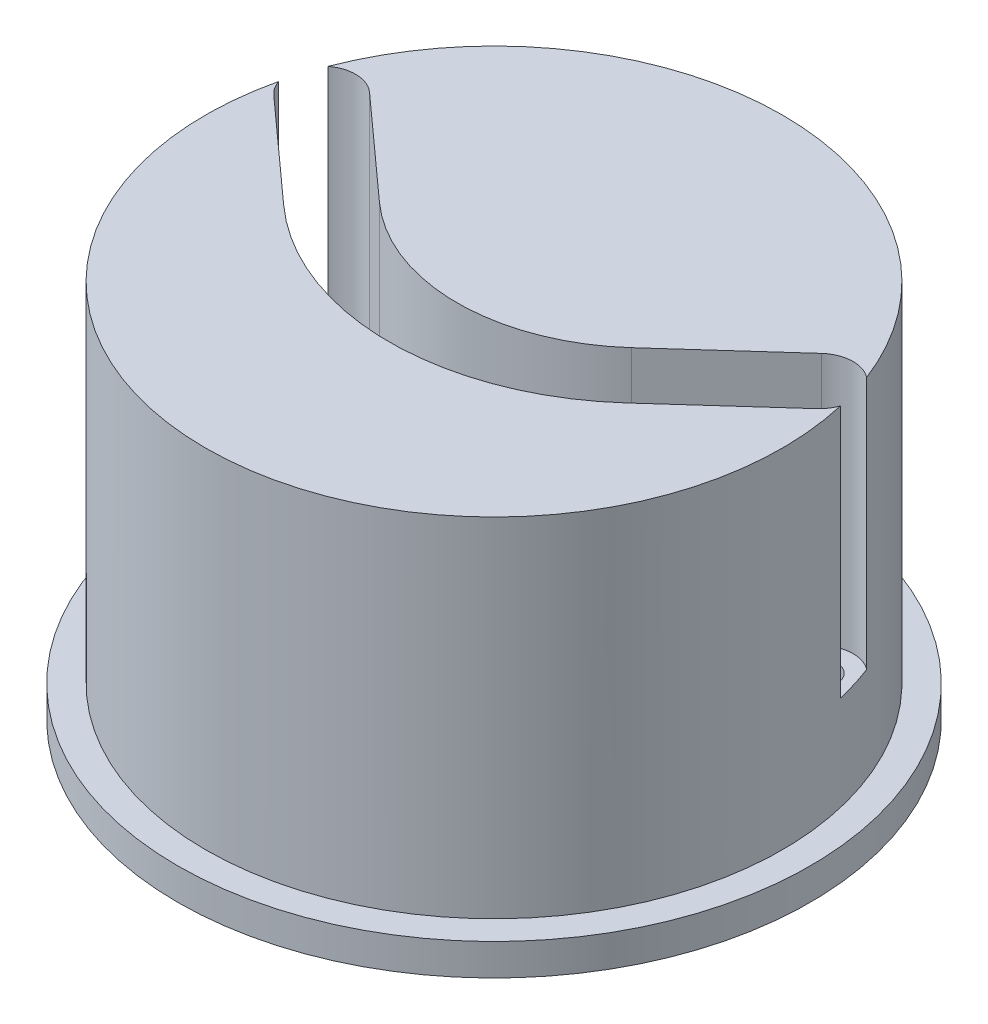
ISO-10303-21;
HEADER;
FILE_DESCRIPTION(('STEP AP214'),'2;1');
FILE_NAME('part.step','',(''),(''),'','','');
FILE_SCHEMA(('AUTOMOTIVE_DESIGN { 1 0 10303 214 1 1 1 1 }'));
ENDSEC;
DATA;
#1=APPLICATION_CONTEXT('core data for automotive mechanical design processes');
#2=APPLICATION_PROTOCOL_DEFINITION('international standard','automotive_design',2000,#1);
#3=PRODUCT_CONTEXT('',#1,'mechanical');
#4=PRODUCT('Part','Part','',(#3));
#5=PRODUCT_RELATED_PRODUCT_CATEGORY('part','',(#4));
#6=PRODUCT_DEFINITION_FORMATION('','',#4);
#7=PRODUCT_DEFINITION_CONTEXT('part definition',#1,'design');
#8=PRODUCT_DEFINITION('design','',#6,#7);
#9=PRODUCT_DEFINITION_SHAPE('','',#8);
#10=(LENGTH_UNIT() NAMED_UNIT(*) SI_UNIT(.MILLI.,.METRE.));
#11=(NAMED_UNIT(*) PLANE_ANGLE_UNIT() SI_UNIT($,.RADIAN.));
#12=(NAMED_UNIT(*) SI_UNIT($,.STERADIAN.) SOLID_ANGLE_UNIT());
#13=UNCERTAINTY_MEASURE_WITH_UNIT(LENGTH_MEASURE(1.E-05),#10,'distance_accuracy_value','');
#14=(GEOMETRIC_REPRESENTATION_CONTEXT(3) GLOBAL_UNCERTAINTY_ASSIGNED_CONTEXT((#13)) GLOBAL_UNIT_ASSIGNED_CONTEXT((#10,
#11,#12)) REPRESENTATION_CONTEXT('',''));
#15=CARTESIAN_POINT('',(0.,0.,0.));
#16=DIRECTION('',(0.,0.,1.));
#17=DIRECTION('',(1.,0.,0.));
#18=AXIS2_PLACEMENT_3D('',#15,#16,#17);
#19=CARTESIAN_POINT('',(0.,19.05,0.));
#20=DIRECTION('',(0.,-1.,0.));
#21=DIRECTION('',(0.,0.,-1.));
#22=AXIS2_PLACEMENT_3D('',#19,#20,#21);
#23=CYLINDRICAL_SURFACE('',#22,14.478);
#24=CARTESIAN_POINT('',(0.,6.35,0.));
#25=DIRECTION('',(0.,1.,0.));
#26=DIRECTION('',(0.,0.,1.));
#27=AXIS2_PLACEMENT_3D('',#24,#25,#26);
#28=CIRCLE('',#27,14.478);
#29=CARTESIAN_POINT('',(14.0987033774357,6.35,-3.29227080828451));
#30=VERTEX_POINT('',#29);
#31=CARTESIAN_POINT('',(13.5156415070669,6.35,-5.1903678725548));
#32=VERTEX_POINT('',#31);
#33=EDGE_CURVE('E181',#30,#32,#28,.T.);
#34=ORIENTED_EDGE('',*,*,#33,.F.);
#35=DIRECTION('',(0.,1.,0.));
#36=VECTOR('',#35,1.);
#37=CARTESIAN_POINT('',(14.0987033774357,12.7,-3.29227080828454));
#38=LINE('',#37,#36);
#39=CARTESIAN_POINT('',(14.0987033774357,19.05,-3.29227080828451));
#40=VERTEX_POINT('',#39);
#41=EDGE_CURVE('E44',#30,#40,#38,.T.);
#42=ORIENTED_EDGE('',*,*,#41,.T.);
#43=CARTESIAN_POINT('',(0.,19.05,0.));
#44=DIRECTION('',(0.,1.,0.));
#45=DIRECTION('',(0.,0.,1.));
#46=AXIS2_PLACEMENT_3D('',#43,#44,#45);
#47=CIRCLE('',#46,14.478);
#48=CARTESIAN_POINT('',(-14.0987033774357,19.05,-3.29227080828451));
#49=VERTEX_POINT('',#48);
#50=EDGE_CURVE('E313',#49,#40,#47,.T.);
#51=ORIENTED_EDGE('',*,*,#50,.F.);
#52=DIRECTION('',(0.,1.,0.));
#53=VECTOR('',#52,1.);
#54=CARTESIAN_POINT('',(-14.0987033774357,12.7,-3.29227080828454));
#55=LINE('',#54,#53);
#56=CARTESIAN_POINT('',(-14.0987033774357,6.35,-3.29227080828451));
#57=VERTEX_POINT('',#56);
#58=EDGE_CURVE('E319',#49,#57,#55,.F.);
#59=ORIENTED_EDGE('',*,*,#58,.T.);
#60=CARTESIAN_POINT('',(-13.5156415070669,6.35,-5.1903678725548));
#61=VERTEX_POINT('',#60);
#62=EDGE_CURVE('E271',#61,#57,#28,.T.);
#63=ORIENTED_EDGE('',*,*,#62,.F.);
#64=DIRECTION('',(0.,1.,0.));
#65=VECTOR('',#64,1.);
#66=CARTESIAN_POINT('',(-13.515641507067,12.7,-5.19036787255479));
#67=LINE('',#66,#65);
#68=CARTESIAN_POINT('',(-13.5156415070669,19.05,-5.1903678725548));
#69=VERTEX_POINT('',#68);
#70=EDGE_CURVE('E322',#61,#69,#67,.T.);
#71=ORIENTED_EDGE('',*,*,#70,.T.);
#72=CARTESIAN_POINT('',(13.5156415070669,19.05,-5.1903678725548));
#73=VERTEX_POINT('',#72);
#74=EDGE_CURVE('E316',#73,#69,#47,.T.);
#75=ORIENTED_EDGE('',*,*,#74,.F.);
#76=DIRECTION('',(0.,1.,0.));
#77=VECTOR('',#76,1.);
#78=CARTESIAN_POINT('',(13.515641507067,12.7,-5.19036787255479));
#79=LINE('',#78,#77);
#80=EDGE_CURVE('E325',#73,#32,#79,.F.);
#81=ORIENTED_EDGE('',*,*,#80,.T.);
#82=EDGE_LOOP('',(#34,#42,#51,#59,#63,#71,#75,#81));
#83=FACE_BOUND('',#82,.T.);
#84=CARTESIAN_POINT('',(0.,1.5875,0.));
#85=DIRECTION('',(0.,-1.,0.));
#86=DIRECTION('',(0.,0.,-1.));
#87=AXIS2_PLACEMENT_3D('',#84,#85,#86);
#88=CIRCLE('',#87,14.478);
#89=CARTESIAN_POINT('',(0.,1.5875,-14.478));
#90=VERTEX_POINT('',#89);
#91=EDGE_CURVE('E11',#90,#90,#88,.T.);
#92=ORIENTED_EDGE('',*,*,#91,.F.);
#93=EDGE_LOOP('',(#92));
#94=FACE_BOUND('',#93,.T.);
#95=ADVANCED_FACE('F37',(#83,#94),#23,.T.);
#96=CARTESIAN_POINT('',(0.,19.05,0.));
#97=DIRECTION('',(0.,1.,0.));
#98=DIRECTION('',(0.,0.,1.));
#99=AXIS2_PLACEMENT_3D('',#96,#97,#98);
#100=PLANE('',#99);
#101=CARTESIAN_POINT('',(12.4859182363819,19.05,-3.83545340078554));
#102=DIRECTION('',(0.,1.,0.));
#103=DIRECTION('',(0.,0.,1.));
#104=AXIS2_PLACEMENT_3D('',#101,#102,#103);
#105=CIRCLE('',#104,1.7018);
#106=CARTESIAN_POINT('',(13.625074755308,19.05,-2.57115689071037));
#107=VERTEX_POINT('',#106);
#108=EDGE_CURVE('E217',#107,#40,#105,.T.);
#109=ORIENTED_EDGE('',*,*,#108,.F.);
#110=DIRECTION('',(0.742917211232324,0.,-0.66938331115646));
#111=VECTOR('',#110,1.);
#112=CARTESIAN_POINT('',(8.6031820683073,19.05,1.95366916564239));
#113=LINE('',#112,#111);
#114=CARTESIAN_POINT('',(8.6031820683073,19.05,1.95366916564239));
#115=VERTEX_POINT('',#114);
#116=EDGE_CURVE('E185',#115,#107,#113,.T.);
#117=ORIENTED_EDGE('',*,*,#116,.F.);
#118=CARTESIAN_POINT('',(0.,19.05,-7.59459999999993));
#119=DIRECTION('',(0.,1.,0.));
#120=DIRECTION('',(0.,0.,1.));
#121=AXIS2_PLACEMENT_3D('',#118,#119,#120);
#122=CIRCLE('',#121,12.8524);
#123=CARTESIAN_POINT('',(-8.6031820683073,19.05,1.95366916564239));
#124=VERTEX_POINT('',#123);
#125=EDGE_CURVE('E233',#124,#115,#122,.T.);
#126=ORIENTED_EDGE('',*,*,#125,.F.);
#127=DIRECTION('',(0.742917211232324,0.,0.66938331115646));
#128=VECTOR('',#127,1.);
#129=CARTESIAN_POINT('',(-13.625074755308,19.05,-2.57115689071037));
#130=LINE('',#129,#128);
#131=CARTESIAN_POINT('',(-13.625074755308,19.05,-2.57115689071037));
#132=VERTEX_POINT('',#131);
#133=EDGE_CURVE('E230',#132,#124,#130,.T.);
#134=ORIENTED_EDGE('',*,*,#133,.F.);
#135=CARTESIAN_POINT('',(-12.4859182363819,19.05,-3.83545340078554));
#136=DIRECTION('',(0.,1.,0.));
#137=DIRECTION('',(0.,0.,1.));
#138=AXIS2_PLACEMENT_3D('',#135,#136,#137);
#139=CIRCLE('',#138,1.7018);
#140=EDGE_CURVE('E227',#49,#132,#139,.T.);
#141=ORIENTED_EDGE('',*,*,#140,.F.);
#142=ORIENTED_EDGE('',*,*,#50,.T.);
#143=EDGE_LOOP('',(#109,#117,#126,#134,#141,#142));
#144=FACE_BOUND('',#143,.T.);
#145=ADVANCED_FACE('F335',(#144),#100,.T.);
#146=CARTESIAN_POINT('',(-12.4859182363819,19.05,-3.83545340078554));
#147=DIRECTION('',(0.,-1.,0.));
#148=DIRECTION('',(0.,0.,-1.));
#149=AXIS2_PLACEMENT_3D('',#146,#147,#148);
#150=CYLINDRICAL_SURFACE('',#149,0.889000000000001);
#151=CARTESIAN_POINT('',(-12.4859182363819,0.,-3.83545340078554));
#152=DIRECTION('',(0.,1.,0.));
#153=DIRECTION('',(0.,0.,-1.));
#154=AXIS2_PLACEMENT_3D('',#151,#152,#153);
#155=CIRCLE('',#154,0.889000000000001);
#156=CARTESIAN_POINT('',(-11.8908364727639,0.,-4.49590680157107));
#157=VERTEX_POINT('',#156);
#158=CARTESIAN_POINT('',(-13.081,0.,-3.175));
#159=VERTEX_POINT('',#158);
#160=EDGE_CURVE('E273',#157,#159,#155,.T.);
#161=ORIENTED_EDGE('',*,*,#160,.F.);
#162=DIRECTION('',(0.,-1.,0.));
#163=VECTOR('',#162,1.);
#164=CARTESIAN_POINT('',(-11.8908364727638,19.05,-4.49590680157107));
#165=LINE('',#164,#163);
#166=CARTESIAN_POINT('',(-11.8908364727638,6.35,-4.49590680157107));
#167=VERTEX_POINT('',#166);
#168=EDGE_CURVE('E297',#167,#157,#165,.T.);
#169=ORIENTED_EDGE('',*,*,#168,.F.);
#170=CARTESIAN_POINT('',(-12.4859182363819,6.35,-3.83545340078554));
#171=DIRECTION('',(0.,1.,0.));
#172=DIRECTION('',(0.,0.,1.));
#173=AXIS2_PLACEMENT_3D('',#170,#171,#172);
#174=CIRCLE('',#173,0.889000000000001);
#175=CARTESIAN_POINT('',(-13.081,6.35,-3.175));
#176=VERTEX_POINT('',#175);
#177=EDGE_CURVE('E59',#167,#176,#174,.T.);
#178=ORIENTED_EDGE('',*,*,#177,.T.);
#179=DIRECTION('',(0.,-1.,0.));
#180=VECTOR('',#179,1.);
#181=CARTESIAN_POINT('',(-13.081,19.05,-3.175));
#182=LINE('',#181,#180);
#183=EDGE_CURVE('E311',#176,#159,#182,.T.);
#184=ORIENTED_EDGE('',*,*,#183,.T.);
#185=EDGE_LOOP('',(#161,#169,#178,#184));
#186=FACE_BOUND('',#185,.T.);
#187=ADVANCED_FACE('F385',(#186),#150,.F.);
#188=CARTESIAN_POINT('',(-13.081,19.05,-3.175));
#189=DIRECTION('',(0.66938331115646,0.,-0.742917211232324));
#190=DIRECTION('',(-0.742917211232324,0.,-0.66938331115646));
#191=AXIS2_PLACEMENT_3D('',#188,#189,#190);
#192=PLANE('',#191);
#193=DIRECTION('',(0.742917211232324,0.,0.66938331115646));
#194=VECTOR('',#193,1.);
#195=CARTESIAN_POINT('',(-13.081,0.,-3.175));
#196=LINE('',#195,#194);
#197=CARTESIAN_POINT('',(-8.05910731299933,0.,1.34982605635276));
#198=VERTEX_POINT('',#197);
#199=EDGE_CURVE('E276',#159,#198,#196,.T.);
#200=ORIENTED_EDGE('',*,*,#199,.F.);
#201=ORIENTED_EDGE('',*,*,#183,.F.);
#202=DIRECTION('',(0.742917211232324,0.,0.66938331115646));
#203=VECTOR('',#202,1.);
#204=CARTESIAN_POINT('',(-13.081,6.35,-3.175));
#205=LINE('',#204,#203);
#206=CARTESIAN_POINT('',(-8.05910731299933,6.35,1.34982605635276));
#207=VERTEX_POINT('',#206);
#208=EDGE_CURVE('E267',#176,#207,#205,.T.);
#209=ORIENTED_EDGE('',*,*,#208,.T.);
#210=DIRECTION('',(0.,-1.,0.));
#211=VECTOR('',#210,1.);
#212=CARTESIAN_POINT('',(-8.05910731299933,19.05,1.34982605635276));
#213=LINE('',#212,#211);
#214=EDGE_CURVE('E309',#207,#198,#213,.T.);
#215=ORIENTED_EDGE('',*,*,#214,.T.);
#216=EDGE_LOOP('',(#200,#201,#209,#215));
#217=FACE_BOUND('',#216,.T.);
#218=ADVANCED_FACE('F390',(#217),#192,.T.);
#219=CARTESIAN_POINT('',(0.,19.05,-7.59459999999993));
#220=DIRECTION('',(0.,-1.,0.));
#221=DIRECTION('',(0.,0.,-1.));
#222=AXIS2_PLACEMENT_3D('',#219,#220,#221);
#223=CYLINDRICAL_SURFACE('',#222,12.0396);
#224=CARTESIAN_POINT('',(0.,0.,-7.59459999999993));
#225=DIRECTION('',(0.,1.,0.));
#226=DIRECTION('',(0.,0.,1.));
#227=AXIS2_PLACEMENT_3D('',#224,#225,#226);
#228=CIRCLE('',#227,12.0396);
#229=CARTESIAN_POINT('',(8.05910731299933,0.,1.34982605635276));
#230=VERTEX_POINT('',#229);
#231=EDGE_CURVE('E279',#198,#230,#228,.T.);
#232=ORIENTED_EDGE('',*,*,#231,.F.);
#233=ORIENTED_EDGE('',*,*,#214,.F.);
#234=CARTESIAN_POINT('',(0.,6.35,-7.59459999999993));
#235=DIRECTION('',(0.,1.,0.));
#236=DIRECTION('',(0.,0.,1.));
#237=AXIS2_PLACEMENT_3D('',#234,#235,#236);
#238=CIRCLE('',#237,12.0396);
#239=CARTESIAN_POINT('',(8.05910731299933,6.35,1.34982605635276));
#240=VERTEX_POINT('',#239);
#241=EDGE_CURVE('E264',#207,#240,#238,.T.);
#242=ORIENTED_EDGE('',*,*,#241,.T.);
#243=DIRECTION('',(0.,-1.,0.));
#244=VECTOR('',#243,1.);
#245=CARTESIAN_POINT('',(8.05910731299933,19.05,1.34982605635276));
#246=LINE('',#245,#244);
#247=EDGE_CURVE('E307',#240,#230,#246,.T.);
#248=ORIENTED_EDGE('',*,*,#247,.T.);
#249=EDGE_LOOP('',(#232,#233,#242,#248));
#250=FACE_BOUND('',#249,.T.);
#251=ADVANCED_FACE('F423',(#250),#223,.F.);
#252=CARTESIAN_POINT('',(13.081,19.05,-3.175));
#253=DIRECTION('',(-0.66938331115646,0.,-0.742917211232324));
#254=DIRECTION('',(-0.742917211232324,0.,0.66938331115646));
#255=AXIS2_PLACEMENT_3D('',#252,#253,#254);
#256=PLANE('',#255);
#257=DIRECTION('',(0.742917211232324,0.,-0.66938331115646));
#258=VECTOR('',#257,1.);
#259=CARTESIAN_POINT('',(13.081,0.,-3.175));
#260=LINE('',#259,#258);
#261=CARTESIAN_POINT('',(13.081,0.,-3.175));
#262=VERTEX_POINT('',#261);
#263=EDGE_CURVE('E282',#230,#262,#260,.T.);
#264=ORIENTED_EDGE('',*,*,#263,.F.);
#265=ORIENTED_EDGE('',*,*,#247,.F.);
#266=DIRECTION('',(0.742917211232324,0.,-0.66938331115646));
#267=VECTOR('',#266,1.);
#268=CARTESIAN_POINT('',(13.081,6.35,-3.175));
#269=LINE('',#268,#267);
#270=CARTESIAN_POINT('',(13.081,6.35,-3.175));
#271=VERTEX_POINT('',#270);
#272=EDGE_CURVE('E261',#240,#271,#269,.T.);
#273=ORIENTED_EDGE('',*,*,#272,.T.);
#274=DIRECTION('',(0.,-1.,0.));
#275=VECTOR('',#274,1.);
#276=CARTESIAN_POINT('',(13.081,19.05,-3.175));
#277=LINE('',#276,#275);
#278=EDGE_CURVE('E305',#271,#262,#277,.T.);
#279=ORIENTED_EDGE('',*,*,#278,.T.);
#280=EDGE_LOOP('',(#264,#265,#273,#279));
#281=FACE_BOUND('',#280,.T.);
#282=ADVANCED_FACE('F419',(#281),#256,.T.);
#283=CARTESIAN_POINT('',(12.4859182363819,19.05,-3.83545340078554));
#284=DIRECTION('',(0.,-1.,0.));
#285=DIRECTION('',(0.,0.,-1.));
#286=AXIS2_PLACEMENT_3D('',#283,#284,#285);
#287=CYLINDRICAL_SURFACE('',#286,0.889000000000001);
#288=CARTESIAN_POINT('',(12.4859182363819,0.,-3.83545340078554));
#289=DIRECTION('',(0.,1.,0.));
#290=DIRECTION('',(0.,0.,-1.));
#291=AXIS2_PLACEMENT_3D('',#288,#289,#290);
#292=CIRCLE('',#291,0.889000000000001);
#293=CARTESIAN_POINT('',(11.8908364727638,0.,-4.49590680157107));
#294=VERTEX_POINT('',#293);
#295=EDGE_CURVE('E285',#262,#294,#292,.T.);
#296=ORIENTED_EDGE('',*,*,#295,.F.);
#297=ORIENTED_EDGE('',*,*,#278,.F.);
#298=CARTESIAN_POINT('',(12.4859182363819,6.35,-3.83545340078554));
#299=DIRECTION('',(0.,1.,0.));
#300=DIRECTION('',(0.,0.,1.));
#301=AXIS2_PLACEMENT_3D('',#298,#299,#300);
#302=CIRCLE('',#301,0.889000000000001);
#303=CARTESIAN_POINT('',(11.8908364727638,6.35,-4.49590680157107));
#304=VERTEX_POINT('',#303);
#305=EDGE_CURVE('E258',#271,#304,#302,.T.);
#306=ORIENTED_EDGE('',*,*,#305,.T.);
#307=DIRECTION('',(0.,-1.,0.));
#308=VECTOR('',#307,1.);
#309=CARTESIAN_POINT('',(11.8908364727638,19.05,-4.49590680157107));
#310=LINE('',#309,#308);
#311=EDGE_CURVE('E303',#304,#294,#310,.T.);
#312=ORIENTED_EDGE('',*,*,#311,.T.);
#313=EDGE_LOOP('',(#296,#297,#306,#312));
#314=FACE_BOUND('',#313,.T.);
#315=ADVANCED_FACE('F415',(#314),#287,.F.);
#316=CARTESIAN_POINT('',(11.8908364727638,19.05,-4.49590680157107));
#317=DIRECTION('',(0.66938331115646,0.,0.742917211232324));
#318=DIRECTION('',(0.742917211232324,0.,-0.66938331115646));
#319=AXIS2_PLACEMENT_3D('',#316,#317,#318);
#320=PLANE('',#319);
#321=DIRECTION('',(-0.742917211232324,0.,0.66938331115646));
#322=VECTOR('',#321,1.);
#323=CARTESIAN_POINT('',(11.8908364727638,0.,-4.49590680157107));
#324=LINE('',#323,#322);
#325=CARTESIAN_POINT('',(6.86894378576314,0.,0.0289192547816858));
#326=VERTEX_POINT('',#325);
#327=EDGE_CURVE('E288',#294,#326,#324,.T.);
#328=ORIENTED_EDGE('',*,*,#327,.F.);
#329=ORIENTED_EDGE('',*,*,#311,.F.);
#330=DIRECTION('',(-0.742917211232324,0.,0.66938331115646));
#331=VECTOR('',#330,1.);
#332=CARTESIAN_POINT('',(11.8908364727638,6.35,-4.49590680157107));
#333=LINE('',#332,#331);
#334=CARTESIAN_POINT('',(6.86894378576314,6.35,0.0289192547816858));
#335=VERTEX_POINT('',#334);
#336=EDGE_CURVE('E255',#304,#335,#333,.T.);
#337=ORIENTED_EDGE('',*,*,#336,.T.);
#338=DIRECTION('',(0.,-1.,0.));
#339=VECTOR('',#338,1.);
#340=CARTESIAN_POINT('',(6.86894378576314,19.05,0.0289192547816858));
#341=LINE('',#340,#339);
#342=EDGE_CURVE('E301',#335,#326,#341,.T.);
#343=ORIENTED_EDGE('',*,*,#342,.T.);
#344=EDGE_LOOP('',(#328,#329,#337,#343));
#345=FACE_BOUND('',#344,.T.);
#346=ADVANCED_FACE('F407',(#345),#320,.T.);
#347=CARTESIAN_POINT('',(0.,19.05,-7.59459999999993));
#348=DIRECTION('',(0.,-1.,0.));
#349=DIRECTION('',(0.,0.,-1.));
#350=AXIS2_PLACEMENT_3D('',#347,#348,#349);
#351=CYLINDRICAL_SURFACE('',#350,10.2616);
#352=CARTESIAN_POINT('',(0.,0.,-7.59459999999993));
#353=DIRECTION('',(0.,-1.,0.));
#354=DIRECTION('',(0.,0.,1.));
#355=AXIS2_PLACEMENT_3D('',#352,#353,#354);
#356=CIRCLE('',#355,10.2616);
#357=CARTESIAN_POINT('',(-6.86894378576314,0.,0.0289192547816876));
#358=VERTEX_POINT('',#357);
#359=EDGE_CURVE('E291',#326,#358,#356,.T.);
#360=ORIENTED_EDGE('',*,*,#359,.F.);
#361=ORIENTED_EDGE('',*,*,#342,.F.);
#362=CARTESIAN_POINT('',(0.,6.35,-7.59459999999993));
#363=DIRECTION('',(0.,1.,0.));
#364=DIRECTION('',(0.,0.,1.));
#365=AXIS2_PLACEMENT_3D('',#362,#363,#364);
#366=CIRCLE('',#365,10.2616);
#367=CARTESIAN_POINT('',(-6.86894378576314,6.35,0.0289192547816867));
#368=VERTEX_POINT('',#367);
#369=EDGE_CURVE('E240',#335,#368,#366,.F.);
#370=ORIENTED_EDGE('',*,*,#369,.T.);
#371=DIRECTION('',(0.,-1.,0.));
#372=VECTOR('',#371,1.);
#373=CARTESIAN_POINT('',(-6.86894378576314,19.05,0.0289192547816876));
#374=LINE('',#373,#372);
#375=EDGE_CURVE('E299',#368,#358,#374,.T.);
#376=ORIENTED_EDGE('',*,*,#375,.T.);
#377=EDGE_LOOP('',(#360,#361,#370,#376));
#378=FACE_BOUND('',#377,.T.);
#379=ADVANCED_FACE('F401',(#378),#351,.T.);
#380=CARTESIAN_POINT('',(-11.8908364727638,19.05,-4.49590680157107));
#381=DIRECTION('',(-0.669383311156461,0.,0.742917211232324));
#382=DIRECTION('',(0.742917211232324,0.,0.669383311156461));
#383=AXIS2_PLACEMENT_3D('',#380,#381,#382);
#384=PLANE('',#383);
#385=DIRECTION('',(-0.742917211232324,0.,-0.669383311156461));
#386=VECTOR('',#385,1.);
#387=CARTESIAN_POINT('',(-11.8908364727638,0.,-4.49590680157107));
#388=LINE('',#387,#386);
#389=EDGE_CURVE('E294',#358,#157,#388,.T.);
#390=ORIENTED_EDGE('',*,*,#389,.F.);
#391=ORIENTED_EDGE('',*,*,#375,.F.);
#392=DIRECTION('',(-0.742917211232324,0.,-0.669383311156461));
#393=VECTOR('',#392,1.);
#394=CARTESIAN_POINT('',(-11.8908364727638,6.35,-4.49590680157107));
#395=LINE('',#394,#393);
#396=EDGE_CURVE('E317',#368,#167,#395,.T.);
#397=ORIENTED_EDGE('',*,*,#396,.T.);
#398=ORIENTED_EDGE('',*,*,#168,.T.);
#399=EDGE_LOOP('',(#390,#391,#397,#398));
#400=FACE_BOUND('',#399,.T.);
#401=ADVANCED_FACE('F394',(#400),#384,.T.);
#402=CARTESIAN_POINT('',(11.3467617174559,19.05,-5.09974991086071));
#403=VERTEX_POINT('',#402);
#404=EDGE_CURVE('E191',#73,#403,#105,.T.);
#405=ORIENTED_EDGE('',*,*,#404,.F.);
#406=ORIENTED_EDGE('',*,*,#74,.T.);
#407=CARTESIAN_POINT('',(-11.3467617174559,19.05,-5.09974991086071));
#408=VERTEX_POINT('',#407);
#409=EDGE_CURVE('E228',#408,#69,#139,.T.);
#410=ORIENTED_EDGE('',*,*,#409,.F.);
#411=DIRECTION('',(-0.742917211232324,0.,-0.669383311156461));
#412=VECTOR('',#411,1.);
#413=CARTESIAN_POINT('',(-6.32486903045517,19.05,-0.574923854507948));
#414=LINE('',#413,#412);
#415=CARTESIAN_POINT('',(-6.32486903045517,19.05,-0.574923854507948));
#416=VERTEX_POINT('',#415);
#417=EDGE_CURVE('E224',#416,#408,#414,.T.);
#418=ORIENTED_EDGE('',*,*,#417,.F.);
#419=CARTESIAN_POINT('',(0.,19.05,-7.59459999999993));
#420=DIRECTION('',(0.,-1.,0.));
#421=DIRECTION('',(0.,0.,1.));
#422=AXIS2_PLACEMENT_3D('',#419,#420,#421);
#423=CIRCLE('',#422,9.44880000000001);
#424=CARTESIAN_POINT('',(6.32486903045518,19.05,-0.574923854507948));
#425=VERTEX_POINT('',#424);
#426=EDGE_CURVE('E221',#425,#416,#423,.T.);
#427=ORIENTED_EDGE('',*,*,#426,.F.);
#428=DIRECTION('',(-0.742917211232324,0.,0.669383311156461));
#429=VECTOR('',#428,1.);
#430=CARTESIAN_POINT('',(11.3467617174559,19.05,-5.09974991086071));
#431=LINE('',#430,#429);
#432=EDGE_CURVE('E219',#403,#425,#431,.T.);
#433=ORIENTED_EDGE('',*,*,#432,.F.);
#434=EDGE_LOOP('',(#405,#406,#410,#418,#427,#433));
#435=FACE_BOUND('',#434,.T.);
#436=ADVANCED_FACE('F354',(#435),#100,.T.);
#437=CARTESIAN_POINT('',(0.,0.,0.));
#438=DIRECTION('',(0.,1.,0.));
#439=DIRECTION('',(0.,0.,1.));
#440=AXIS2_PLACEMENT_3D('',#437,#438,#439);
#441=PLANE('',#440);
#442=ORIENTED_EDGE('',*,*,#160,.T.);
#443=ORIENTED_EDGE('',*,*,#199,.T.);
#444=ORIENTED_EDGE('',*,*,#231,.T.);
#445=ORIENTED_EDGE('',*,*,#263,.T.);
#446=ORIENTED_EDGE('',*,*,#295,.T.);
#447=ORIENTED_EDGE('',*,*,#327,.T.);
#448=ORIENTED_EDGE('',*,*,#359,.T.);
#449=ORIENTED_EDGE('',*,*,#389,.T.);
#450=EDGE_LOOP('',(#442,#443,#444,#445,#446,#447,#448,#449));
#451=FACE_BOUND('',#450,.T.);
#452=CARTESIAN_POINT('',(0.,0.,0.));
#453=DIRECTION('',(0.,-1.,0.));
#454=DIRECTION('',(0.,0.,-1.));
#455=AXIS2_PLACEMENT_3D('',#452,#453,#454);
#456=CIRCLE('',#455,15.875);
#457=CARTESIAN_POINT('',(0.,0.,-15.875));
#458=VERTEX_POINT('',#457);
#459=EDGE_CURVE('E359',#458,#458,#456,.T.);
#460=ORIENTED_EDGE('',*,*,#459,.T.);
#461=EDGE_LOOP('',(#460));
#462=FACE_BOUND('',#461,.T.);
#463=ADVANCED_FACE('F366',(#451,#462),#441,.F.);
#464=CARTESIAN_POINT('',(12.4859182363819,6.35,-3.83545340078554));
#465=DIRECTION('',(0.,1.,0.));
#466=DIRECTION('',(0.,0.,1.));
#467=AXIS2_PLACEMENT_3D('',#464,#465,#466);
#468=CYLINDRICAL_SURFACE('',#467,1.7018);
#469=CARTESIAN_POINT('',(12.4859182363819,6.35,-3.83545340078554));
#470=DIRECTION('',(0.,1.,0.));
#471=DIRECTION('',(0.,0.,1.));
#472=AXIS2_PLACEMENT_3D('',#469,#470,#471);
#473=CIRCLE('',#472,1.7018);
#474=CARTESIAN_POINT('',(13.625074755308,6.35,-2.57115689071037));
#475=VERTEX_POINT('',#474);
#476=EDGE_CURVE('E184',#475,#30,#473,.T.);
#477=ORIENTED_EDGE('',*,*,#476,.F.);
#478=DIRECTION('',(0.,1.,0.));
#479=VECTOR('',#478,1.);
#480=CARTESIAN_POINT('',(13.625074755308,6.35,-2.57115689071037));
#481=LINE('',#480,#479);
#482=EDGE_CURVE('E238',#475,#107,#481,.T.);
#483=ORIENTED_EDGE('',*,*,#482,.T.);
#484=ORIENTED_EDGE('',*,*,#108,.T.);
#485=ORIENTED_EDGE('',*,*,#41,.F.);
#486=EDGE_LOOP('',(#477,#483,#484,#485));
#487=FACE_BOUND('',#486,.T.);
#488=ADVANCED_FACE('F399',(#487),#468,.F.);
#489=ORIENTED_EDGE('',*,*,#404,.T.);
#490=DIRECTION('',(0.,1.,0.));
#491=VECTOR('',#490,1.);
#492=CARTESIAN_POINT('',(11.3467617174559,6.35,-5.09974991086071));
#493=LINE('',#492,#491);
#494=CARTESIAN_POINT('',(11.3467617174559,6.35,-5.09974991086071));
#495=VERTEX_POINT('',#494);
#496=EDGE_CURVE('E188',#495,#403,#493,.T.);
#497=ORIENTED_EDGE('',*,*,#496,.F.);
#498=EDGE_CURVE('E173',#32,#495,#473,.T.);
#499=ORIENTED_EDGE('',*,*,#498,.F.);
#500=ORIENTED_EDGE('',*,*,#80,.F.);
#501=EDGE_LOOP('',(#489,#497,#499,#500));
#502=FACE_BOUND('',#501,.T.);
#503=ADVANCED_FACE('F189',(#502),#468,.F.);
#504=CARTESIAN_POINT('',(-12.4859182363819,6.35,-3.83545340078554));
#505=DIRECTION('',(0.,1.,0.));
#506=DIRECTION('',(0.,0.,1.));
#507=AXIS2_PLACEMENT_3D('',#504,#505,#506);
#508=CYLINDRICAL_SURFACE('',#507,1.7018);
#509=CARTESIAN_POINT('',(-12.4859182363819,6.35,-3.83545340078554));
#510=DIRECTION('',(0.,1.,0.));
#511=DIRECTION('',(0.,0.,1.));
#512=AXIS2_PLACEMENT_3D('',#509,#510,#511);
#513=CIRCLE('',#512,1.7018);
#514=CARTESIAN_POINT('',(-11.3467617174559,6.35,-5.09974991086071));
#515=VERTEX_POINT('',#514);
#516=EDGE_CURVE('E51',#515,#61,#513,.T.);
#517=ORIENTED_EDGE('',*,*,#516,.F.);
#518=DIRECTION('',(0.,1.,0.));
#519=VECTOR('',#518,1.);
#520=CARTESIAN_POINT('',(-11.3467617174559,6.35,-5.09974991086071));
#521=LINE('',#520,#519);
#522=EDGE_CURVE('E248',#515,#408,#521,.T.);
#523=ORIENTED_EDGE('',*,*,#522,.T.);
#524=ORIENTED_EDGE('',*,*,#409,.T.);
#525=ORIENTED_EDGE('',*,*,#70,.F.);
#526=EDGE_LOOP('',(#517,#523,#524,#525));
#527=FACE_BOUND('',#526,.T.);
#528=ADVANCED_FACE('F456',(#527),#508,.F.);
#529=ORIENTED_EDGE('',*,*,#140,.T.);
#530=DIRECTION('',(0.,1.,0.));
#531=VECTOR('',#530,1.);
#532=CARTESIAN_POINT('',(-13.625074755308,6.35,-2.57115689071037));
#533=LINE('',#532,#531);
#534=CARTESIAN_POINT('',(-13.625074755308,6.35,-2.57115689071037));
#535=VERTEX_POINT('',#534);
#536=EDGE_CURVE('E245',#535,#132,#533,.T.);
#537=ORIENTED_EDGE('',*,*,#536,.F.);
#538=EDGE_CURVE('E207',#57,#535,#513,.T.);
#539=ORIENTED_EDGE('',*,*,#538,.F.);
#540=ORIENTED_EDGE('',*,*,#58,.F.);
#541=EDGE_LOOP('',(#529,#537,#539,#540));
#542=FACE_BOUND('',#541,.T.);
#543=ADVANCED_FACE('F341',(#542),#508,.F.);
#544=CARTESIAN_POINT('',(12.4859182363819,6.35,-3.83545340078554));
#545=DIRECTION('',(0.,1.,0.));
#546=DIRECTION('',(0.,0.,1.));
#547=AXIS2_PLACEMENT_3D('',#544,#545,#546);
#548=PLANE('',#547);
#549=ORIENTED_EDGE('',*,*,#396,.F.);
#550=ORIENTED_EDGE('',*,*,#369,.F.);
#551=ORIENTED_EDGE('',*,*,#336,.F.);
#552=ORIENTED_EDGE('',*,*,#305,.F.);
#553=ORIENTED_EDGE('',*,*,#272,.F.);
#554=ORIENTED_EDGE('',*,*,#241,.F.);
#555=ORIENTED_EDGE('',*,*,#208,.F.);
#556=ORIENTED_EDGE('',*,*,#177,.F.);
#557=EDGE_LOOP('',(#549,#550,#551,#552,#553,#554,#555,#556));
#558=FACE_BOUND('',#557,.T.);
#559=ORIENTED_EDGE('',*,*,#33,.T.);
#560=ORIENTED_EDGE('',*,*,#498,.T.);
#561=DIRECTION('',(-0.742917211232324,0.,0.669383311156461));
#562=VECTOR('',#561,1.);
#563=CARTESIAN_POINT('',(11.3467617174559,6.35,-5.09974991086071));
#564=LINE('',#563,#562);
#565=CARTESIAN_POINT('',(6.32486903045518,6.35,-0.574923854507948));
#566=VERTEX_POINT('',#565);
#567=EDGE_CURVE('E178',#495,#566,#564,.T.);
#568=ORIENTED_EDGE('',*,*,#567,.T.);
#569=CARTESIAN_POINT('',(0.,6.35,-7.59459999999993));
#570=DIRECTION('',(0.,-1.,0.));
#571=DIRECTION('',(0.,0.,1.));
#572=AXIS2_PLACEMENT_3D('',#569,#570,#571);
#573=CIRCLE('',#572,9.44880000000001);
#574=CARTESIAN_POINT('',(-6.32486903045517,6.35,-0.574923854507948));
#575=VERTEX_POINT('',#574);
#576=EDGE_CURVE('E200',#566,#575,#573,.T.);
#577=ORIENTED_EDGE('',*,*,#576,.T.);
#578=DIRECTION('',(-0.742917211232324,0.,-0.669383311156461));
#579=VECTOR('',#578,1.);
#580=CARTESIAN_POINT('',(-6.32486903045517,6.35,-0.574923854507948));
#581=LINE('',#580,#579);
#582=EDGE_CURVE('E202',#575,#515,#581,.T.);
#583=ORIENTED_EDGE('',*,*,#582,.T.);
#584=ORIENTED_EDGE('',*,*,#516,.T.);
#585=ORIENTED_EDGE('',*,*,#62,.T.);
#586=ORIENTED_EDGE('',*,*,#538,.T.);
#587=DIRECTION('',(0.742917211232324,0.,0.66938331115646));
#588=VECTOR('',#587,1.);
#589=CARTESIAN_POINT('',(-13.625074755308,6.35,-2.57115689071037));
#590=LINE('',#589,#588);
#591=CARTESIAN_POINT('',(-8.6031820683073,6.35,1.95366916564239));
#592=VERTEX_POINT('',#591);
#593=EDGE_CURVE('E209',#535,#592,#590,.T.);
#594=ORIENTED_EDGE('',*,*,#593,.T.);
#595=CARTESIAN_POINT('',(0.,6.35,-7.59459999999993));
#596=DIRECTION('',(0.,1.,0.));
#597=DIRECTION('',(0.,0.,1.));
#598=AXIS2_PLACEMENT_3D('',#595,#596,#597);
#599=CIRCLE('',#598,12.8524);
#600=CARTESIAN_POINT('',(8.6031820683073,6.35,1.95366916564239));
#601=VERTEX_POINT('',#600);
#602=EDGE_CURVE('E212',#592,#601,#599,.T.);
#603=ORIENTED_EDGE('',*,*,#602,.T.);
#604=DIRECTION('',(0.742917211232324,0.,-0.66938331115646));
#605=VECTOR('',#604,1.);
#606=CARTESIAN_POINT('',(8.6031820683073,6.35,1.95366916564239));
#607=LINE('',#606,#605);
#608=EDGE_CURVE('E196',#601,#475,#607,.T.);
#609=ORIENTED_EDGE('',*,*,#608,.T.);
#610=ORIENTED_EDGE('',*,*,#476,.T.);
#611=EDGE_LOOP('',(#559,#560,#568,#577,#583,#584,#585,#586,#594,#603,#609,#610));
#612=FACE_BOUND('',#611,.T.);
#613=ADVANCED_FACE('F175',(#558,#612),#548,.T.);
#614=CARTESIAN_POINT('',(8.6031820683073,6.35,1.95366916564239));
#615=DIRECTION('',(0.66938331115646,0.,0.742917211232324));
#616=DIRECTION('',(0.742917211232324,0.,-0.66938331115646));
#617=AXIS2_PLACEMENT_3D('',#614,#615,#616);
#618=PLANE('',#617);
#619=ORIENTED_EDGE('',*,*,#116,.T.);
#620=ORIENTED_EDGE('',*,*,#482,.F.);
#621=ORIENTED_EDGE('',*,*,#608,.F.);
#622=DIRECTION('',(0.,1.,0.));
#623=VECTOR('',#622,1.);
#624=CARTESIAN_POINT('',(8.6031820683073,6.35,1.95366916564239));
#625=LINE('',#624,#623);
#626=EDGE_CURVE('E241',#601,#115,#625,.T.);
#627=ORIENTED_EDGE('',*,*,#626,.T.);
#628=EDGE_LOOP('',(#619,#620,#621,#627));
#629=FACE_BOUND('',#628,.T.);
#630=ADVANCED_FACE('F448',(#629),#618,.F.);
#631=CARTESIAN_POINT('',(0.,6.35,-7.59459999999993));
#632=DIRECTION('',(0.,1.,0.));
#633=DIRECTION('',(0.,0.,1.));
#634=AXIS2_PLACEMENT_3D('',#631,#632,#633);
#635=CYLINDRICAL_SURFACE('',#634,12.8524);
#636=ORIENTED_EDGE('',*,*,#125,.T.);
#637=ORIENTED_EDGE('',*,*,#626,.F.);
#638=ORIENTED_EDGE('',*,*,#602,.F.);
#639=DIRECTION('',(0.,1.,0.));
#640=VECTOR('',#639,1.);
#641=CARTESIAN_POINT('',(-8.6031820683073,6.35,1.95366916564239));
#642=LINE('',#641,#640);
#643=EDGE_CURVE('E243',#592,#124,#642,.T.);
#644=ORIENTED_EDGE('',*,*,#643,.T.);
#645=EDGE_LOOP('',(#636,#637,#638,#644));
#646=FACE_BOUND('',#645,.T.);
#647=ADVANCED_FACE('F453',(#646),#635,.F.);
#648=CARTESIAN_POINT('',(-13.625074755308,6.35,-2.57115689071037));
#649=DIRECTION('',(-0.66938331115646,0.,0.742917211232324));
#650=DIRECTION('',(0.742917211232324,0.,0.66938331115646));
#651=AXIS2_PLACEMENT_3D('',#648,#649,#650);
#652=PLANE('',#651);
#653=ORIENTED_EDGE('',*,*,#133,.T.);
#654=ORIENTED_EDGE('',*,*,#643,.F.);
#655=ORIENTED_EDGE('',*,*,#593,.F.);
#656=ORIENTED_EDGE('',*,*,#536,.T.);
#657=EDGE_LOOP('',(#653,#654,#655,#656));
#658=FACE_BOUND('',#657,.T.);
#659=ADVANCED_FACE('F345',(#658),#652,.F.);
#660=CARTESIAN_POINT('',(-6.32486903045517,6.35,-0.574923854507948));
#661=DIRECTION('',(0.669383311156461,0.,-0.742917211232324));
#662=DIRECTION('',(-0.742917211232324,0.,-0.669383311156461));
#663=AXIS2_PLACEMENT_3D('',#660,#661,#662);
#664=PLANE('',#663);
#665=ORIENTED_EDGE('',*,*,#417,.T.);
#666=ORIENTED_EDGE('',*,*,#522,.F.);
#667=ORIENTED_EDGE('',*,*,#582,.F.);
#668=DIRECTION('',(0.,1.,0.));
#669=VECTOR('',#668,1.);
#670=CARTESIAN_POINT('',(-6.32486903045517,6.35,-0.574923854507948));
#671=LINE('',#670,#669);
#672=EDGE_CURVE('E250',#575,#416,#671,.T.);
#673=ORIENTED_EDGE('',*,*,#672,.T.);
#674=EDGE_LOOP('',(#665,#666,#667,#673));
#675=FACE_BOUND('',#674,.T.);
#676=ADVANCED_FACE('F463',(#675),#664,.F.);
#677=CARTESIAN_POINT('',(0.,6.35,-7.59459999999993));
#678=DIRECTION('',(0.,1.,0.));
#679=DIRECTION('',(0.,0.,1.));
#680=AXIS2_PLACEMENT_3D('',#677,#678,#679);
#681=CYLINDRICAL_SURFACE('',#680,9.44880000000001);
#682=ORIENTED_EDGE('',*,*,#426,.T.);
#683=ORIENTED_EDGE('',*,*,#672,.F.);
#684=ORIENTED_EDGE('',*,*,#576,.F.);
#685=DIRECTION('',(0.,1.,0.));
#686=VECTOR('',#685,1.);
#687=CARTESIAN_POINT('',(6.32486903045518,6.35,-0.574923854507948));
#688=LINE('',#687,#686);
#689=EDGE_CURVE('E195',#566,#425,#688,.T.);
#690=ORIENTED_EDGE('',*,*,#689,.T.);
#691=EDGE_LOOP('',(#682,#683,#684,#690));
#692=FACE_BOUND('',#691,.T.);
#693=ADVANCED_FACE('F378',(#692),#681,.T.);
#694=CARTESIAN_POINT('',(11.3467617174559,6.35,-5.09974991086071));
#695=DIRECTION('',(-0.669383311156461,0.,-0.742917211232324));
#696=DIRECTION('',(-0.742917211232324,0.,0.669383311156461));
#697=AXIS2_PLACEMENT_3D('',#694,#695,#696);
#698=PLANE('',#697);
#699=ORIENTED_EDGE('',*,*,#432,.T.);
#700=ORIENTED_EDGE('',*,*,#689,.F.);
#701=ORIENTED_EDGE('',*,*,#567,.F.);
#702=ORIENTED_EDGE('',*,*,#496,.T.);
#703=EDGE_LOOP('',(#699,#700,#701,#702));
#704=FACE_BOUND('',#703,.T.);
#705=ADVANCED_FACE('F198',(#704),#698,.F.);
#706=CARTESIAN_POINT('',(0.,1.5875,0.));
#707=DIRECTION('',(0.,-1.,0.));
#708=DIRECTION('',(0.,0.,-1.));
#709=AXIS2_PLACEMENT_3D('',#706,#707,#708);
#710=CYLINDRICAL_SURFACE('',#709,15.875);
#711=CARTESIAN_POINT('',(0.,1.5875,0.));
#712=DIRECTION('',(0.,-1.,0.));
#713=DIRECTION('',(0.,0.,-1.));
#714=AXIS2_PLACEMENT_3D('',#711,#712,#713);
#715=CIRCLE('',#714,15.875);
#716=CARTESIAN_POINT('',(0.,1.5875,-15.875));
#717=VERTEX_POINT('',#716);
#718=EDGE_CURVE('E357',#717,#717,#715,.T.);
#719=ORIENTED_EDGE('',*,*,#718,.T.);
#720=EDGE_LOOP('',(#719));
#721=FACE_BOUND('',#720,.T.);
#722=ORIENTED_EDGE('',*,*,#459,.F.);
#723=EDGE_LOOP('',(#722));
#724=FACE_BOUND('',#723,.T.);
#725=ADVANCED_FACE('F368',(#721,#724),#710,.T.);
#726=CARTESIAN_POINT('',(0.,1.5875,0.));
#727=DIRECTION('',(0.,-1.,0.));
#728=DIRECTION('',(0.,0.,-1.));
#729=AXIS2_PLACEMENT_3D('',#726,#727,#728);
#730=PLANE('',#729);
#731=ORIENTED_EDGE('',*,*,#91,.T.);
#732=EDGE_LOOP('',(#731));
#733=FACE_BOUND('',#732,.T.);
#734=ORIENTED_EDGE('',*,*,#718,.F.);
#735=EDGE_LOOP('',(#734));
#736=FACE_BOUND('',#735,.T.);
#737=ADVANCED_FACE('F370',(#733,#736),#730,.F.);
#738=CLOSED_SHELL('',(#95,#145,#187,#218,#251,#282,#315,#346,#379,#401,#436,#463,#488,#503,#528,
#543,#613,#630,#647,#659,#676,#693,#705,#725,#737));
#739=MANIFOLD_SOLID_BREP('B2',#738);
#740=ADVANCED_BREP_SHAPE_REPRESENTATION('',(#18,#739),#14);
#741=SHAPE_DEFINITION_REPRESENTATION(#9,#740);
ENDSEC;
END-ISO-10303-21;
